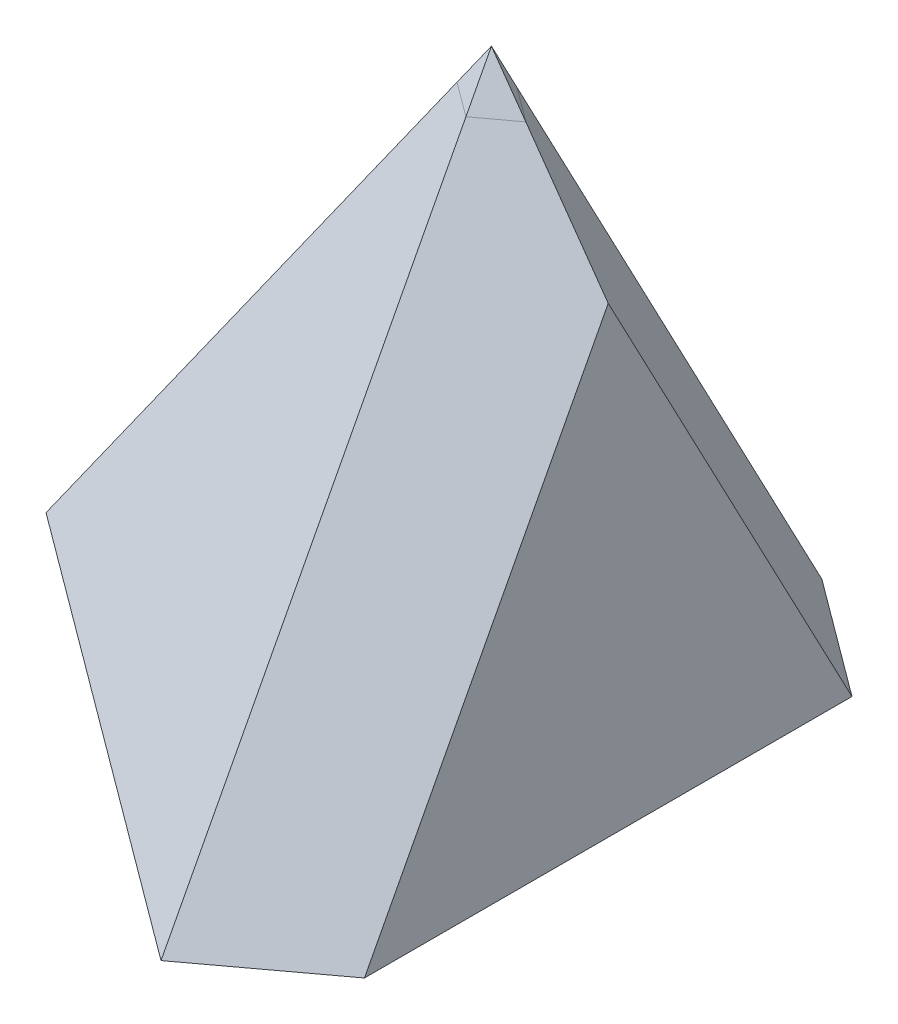
ISO-10303-21;
HEADER;
FILE_DESCRIPTION(('STEP AP214'),'2;1');
FILE_NAME('part.step','',(''),(''),'','','');
FILE_SCHEMA(('AUTOMOTIVE_DESIGN { 1 0 10303 214 1 1 1 1 }'));
ENDSEC;
DATA;
#1=APPLICATION_CONTEXT('core data for automotive mechanical design processes');
#2=APPLICATION_PROTOCOL_DEFINITION('international standard','automotive_design',2000,#1);
#3=PRODUCT_CONTEXT('',#1,'mechanical');
#4=PRODUCT('Part','Part','',(#3));
#5=PRODUCT_RELATED_PRODUCT_CATEGORY('part','',(#4));
#6=PRODUCT_DEFINITION_FORMATION('','',#4);
#7=PRODUCT_DEFINITION_CONTEXT('part definition',#1,'design');
#8=PRODUCT_DEFINITION('design','',#6,#7);
#9=PRODUCT_DEFINITION_SHAPE('','',#8);
#10=(LENGTH_UNIT() NAMED_UNIT(*) SI_UNIT(.MILLI.,.METRE.));
#11=(NAMED_UNIT(*) PLANE_ANGLE_UNIT() SI_UNIT($,.RADIAN.));
#12=(NAMED_UNIT(*) SI_UNIT($,.STERADIAN.) SOLID_ANGLE_UNIT());
#13=UNCERTAINTY_MEASURE_WITH_UNIT(LENGTH_MEASURE(1.E-05),#10,'distance_accuracy_value','');
#14=(GEOMETRIC_REPRESENTATION_CONTEXT(3) GLOBAL_UNCERTAINTY_ASSIGNED_CONTEXT((#13)) GLOBAL_UNIT_ASSIGNED_CONTEXT((#10,
#11,#12)) REPRESENTATION_CONTEXT('',''));
#15=CARTESIAN_POINT('',(0.,0.,0.));
#16=DIRECTION('',(0.,0.,1.));
#17=DIRECTION('',(1.,0.,0.));
#18=AXIS2_PLACEMENT_3D('',#15,#16,#17);
#19=CARTESIAN_POINT('',(-10.3859204869664,7.38088950846095,14.0189080119834));
#20=DIRECTION('',(-0.54824363547868,0.389616471863343,0.740018865306744));
#21=DIRECTION('',(0.803514858417285,0.,0.595284698528907));
#22=AXIS2_PLACEMENT_3D('',#19,#20,#21);
#23=PLANE('',#22);
#24=DIRECTION('',(0.803514858417285,0.,0.595284698528907));
#25=VECTOR('',#24,1.);
#26=CARTESIAN_POINT('',(-0.25183329590656,47.62214178044,0.33992440189573));
#27=LINE('',#26,#25);
#28=CARTESIAN_POINT('',(-0.710663009381156,47.62214178044,0.));
#29=VERTEX_POINT('',#28);
#30=CARTESIAN_POINT('',(0.,47.62214178044,0.526495323469693));
#31=VERTEX_POINT('',#30);
#32=EDGE_CURVE('E206',#29,#31,#27,.T.);
#33=ORIENTED_EDGE('',*,*,#32,.F.);
#34=DIRECTION('',(0.57928117234268,0.815127795728553,0.));
#35=VECTOR('',#34,1.);
#36=CARTESIAN_POINT('',(-59.5546481173834,-35.1793890875358,0.));
#37=LINE('',#36,#35);
#38=CARTESIAN_POINT('',(-59.5546481173834,-35.1793890875358,0.));
#39=VERTEX_POINT('',#38);
#40=EDGE_CURVE('E210',#39,#29,#37,.T.);
#41=ORIENTED_EDGE('',*,*,#40,.F.);
#42=DIRECTION('',(-0.803514858417285,0.,-0.595284698528906));
#43=VECTOR('',#42,1.);
#44=CARTESIAN_POINT('',(-59.5546481173834,-35.1793890875358,0.));
#45=LINE('',#44,#43);
#46=CARTESIAN_POINT('',(0.,-35.1793890875358,44.1211141015896));
#47=VERTEX_POINT('',#46);
#48=EDGE_CURVE('E209',#47,#39,#45,.T.);
#49=ORIENTED_EDGE('',*,*,#48,.F.);
#50=DIRECTION('',(0.,0.884852739411958,-0.465870829259735));
#51=VECTOR('',#50,1.);
#52=CARTESIAN_POINT('',(0.,-35.1793890875358,44.1211141015896));
#53=LINE('',#52,#51);
#54=EDGE_CURVE('E215',#47,#31,#53,.T.);
#55=ORIENTED_EDGE('',*,*,#54,.T.);
#56=EDGE_LOOP('',(#33,#41,#49,#55));
#57=FACE_BOUND('',#56,.T.);
#58=ADVANCED_FACE('F54',(#57),#23,.T.);
#59=CARTESIAN_POINT('',(-10.3859204869664,7.38088950846095,-14.0189080119834));
#60=DIRECTION('',(-0.54824363547868,0.389616471863343,-0.740018865306744));
#61=DIRECTION('',(-0.803514858417285,0.,0.595284698528907));
#62=AXIS2_PLACEMENT_3D('',#59,#60,#61);
#63=PLANE('',#62);
#64=DIRECTION('',(-0.803514858417285,0.,0.595284698528907));
#65=VECTOR('',#64,1.);
#66=CARTESIAN_POINT('',(-0.251833295906561,47.62214178044,-0.33992440189573));
#67=LINE('',#66,#65);
#68=CARTESIAN_POINT('',(0.,47.62214178044,-0.526495323469683));
#69=VERTEX_POINT('',#68);
#70=EDGE_CURVE('E203',#69,#29,#67,.T.);
#71=ORIENTED_EDGE('',*,*,#70,.F.);
#72=DIRECTION('',(0.,0.884852739411958,0.465870829259735));
#73=VECTOR('',#72,1.);
#74=CARTESIAN_POINT('',(0.,-35.1793890875358,-44.1211141015896));
#75=LINE('',#74,#73);
#76=CARTESIAN_POINT('',(0.,-35.1793890875358,-44.1211141015896));
#77=VERTEX_POINT('',#76);
#78=EDGE_CURVE('E218',#77,#69,#75,.T.);
#79=ORIENTED_EDGE('',*,*,#78,.F.);
#80=DIRECTION('',(0.803514858417285,0.,-0.595284698528906));
#81=VECTOR('',#80,1.);
#82=CARTESIAN_POINT('',(0.,-35.1793890875358,-44.1211141015896));
#83=LINE('',#82,#81);
#84=EDGE_CURVE('E227',#39,#77,#83,.T.);
#85=ORIENTED_EDGE('',*,*,#84,.F.);
#86=ORIENTED_EDGE('',*,*,#40,.T.);
#87=EDGE_LOOP('',(#71,#79,#85,#86));
#88=FACE_BOUND('',#87,.T.);
#89=ADVANCED_FACE('F367',(#88),#63,.T.);
#90=CARTESIAN_POINT('',(10.3859204869664,7.38088950846095,14.0189080119834));
#91=DIRECTION('',(0.54824363547868,0.389616471863343,0.740018865306744));
#92=DIRECTION('',(0.803514858417285,0.,-0.595284698528907));
#93=AXIS2_PLACEMENT_3D('',#90,#91,#92);
#94=PLANE('',#93);
#95=DIRECTION('',(0.803514858417285,0.,-0.595284698528907));
#96=VECTOR('',#95,1.);
#97=CARTESIAN_POINT('',(0.25183329590656,47.62214178044,0.33992440189573));
#98=LINE('',#97,#96);
#99=CARTESIAN_POINT('',(0.710663009381138,47.62214178044,0.));
#100=VERTEX_POINT('',#99);
#101=EDGE_CURVE('E80',#31,#100,#98,.T.);
#102=ORIENTED_EDGE('',*,*,#101,.F.);
#103=ORIENTED_EDGE('',*,*,#54,.F.);
#104=DIRECTION('',(-0.803514858417285,0.,0.595284698528907));
#105=VECTOR('',#104,1.);
#106=CARTESIAN_POINT('',(0.,-35.1793890875358,44.1211141015896));
#107=LINE('',#106,#105);
#108=CARTESIAN_POINT('',(59.5546481173834,-35.1793890875358,0.));
#109=VERTEX_POINT('',#108);
#110=EDGE_CURVE('E237',#109,#47,#107,.T.);
#111=ORIENTED_EDGE('',*,*,#110,.F.);
#112=DIRECTION('',(-0.57928117234268,0.815127795728553,0.));
#113=VECTOR('',#112,1.);
#114=CARTESIAN_POINT('',(59.5546481173834,-35.1793890875358,0.));
#115=LINE('',#114,#113);
#116=EDGE_CURVE('E214',#109,#100,#115,.T.);
#117=ORIENTED_EDGE('',*,*,#116,.T.);
#118=EDGE_LOOP('',(#102,#103,#111,#117));
#119=FACE_BOUND('',#118,.T.);
#120=ADVANCED_FACE('F373',(#119),#94,.T.);
#121=CARTESIAN_POINT('',(10.3859204869664,7.38088950846095,-14.0189080119834));
#122=DIRECTION('',(0.54824363547868,0.389616471863343,-0.740018865306744));
#123=DIRECTION('',(-0.803514858417285,0.,-0.595284698528906));
#124=AXIS2_PLACEMENT_3D('',#121,#122,#123);
#125=PLANE('',#124);
#126=DIRECTION('',(-0.803514858417285,0.,-0.595284698528906));
#127=VECTOR('',#126,1.);
#128=CARTESIAN_POINT('',(0.251833295906561,47.62214178044,-0.339924401895727));
#129=LINE('',#128,#127);
#130=EDGE_CURVE('E65',#100,#69,#129,.T.);
#131=ORIENTED_EDGE('',*,*,#130,.F.);
#132=ORIENTED_EDGE('',*,*,#116,.F.);
#133=DIRECTION('',(0.803514858417285,0.,0.595284698528906));
#134=VECTOR('',#133,1.);
#135=CARTESIAN_POINT('',(59.5546481173834,-35.1793890875358,0.));
#136=LINE('',#135,#134);
#137=EDGE_CURVE('E241',#77,#109,#136,.T.);
#138=ORIENTED_EDGE('',*,*,#137,.F.);
#139=ORIENTED_EDGE('',*,*,#78,.T.);
#140=EDGE_LOOP('',(#131,#132,#138,#139));
#141=FACE_BOUND('',#140,.T.);
#142=ADVANCED_FACE('F56',(#141),#125,.T.);
#143=CARTESIAN_POINT('',(0.,47.62214178044,0.));
#144=DIRECTION('',(0.,-1.,0.));
#145=DIRECTION('',(0.,0.,-1.));
#146=AXIS2_PLACEMENT_3D('',#143,#144,#145);
#147=PLANE('',#146);
#148=CARTESIAN_POINT('',(0.,47.62214178044,0.));
#149=DIRECTION('',(0.,-1.,0.));
#150=DIRECTION('',(0.,0.,-1.));
#151=AXIS2_PLACEMENT_3D('',#148,#149,#150);
#152=CIRCLE('',#151,0.268132751535743);
#153=CARTESIAN_POINT('',(0.,47.62214178044,-0.268132751535743));
#154=VERTEX_POINT('',#153);
#155=EDGE_CURVE('E197',#154,#154,#152,.T.);
#156=ORIENTED_EDGE('',*,*,#155,.T.);
#157=EDGE_LOOP('',(#156));
#158=FACE_BOUND('',#157,.T.);
#159=ORIENTED_EDGE('',*,*,#32,.T.);
#160=ORIENTED_EDGE('',*,*,#101,.T.);
#161=ORIENTED_EDGE('',*,*,#130,.T.);
#162=ORIENTED_EDGE('',*,*,#70,.T.);
#163=EDGE_LOOP('',(#159,#160,#161,#162));
#164=FACE_BOUND('',#163,.T.);
#165=ADVANCED_FACE('F378',(#158,#164),#147,.F.);
#166=CARTESIAN_POINT('',(0.,48.62214178044,0.));
#167=DIRECTION('',(0.,-1.,0.));
#168=DIRECTION('',(0.,0.,-1.));
#169=AXIS2_PLACEMENT_3D('',#166,#167,#168);
#170=CYLINDRICAL_SURFACE('',#169,0.268132751535743);
#171=CARTESIAN_POINT('',(0.,48.62214178044,0.));
#172=DIRECTION('',(0.,-1.,0.));
#173=DIRECTION('',(0.,0.,-1.));
#174=AXIS2_PLACEMENT_3D('',#171,#172,#173);
#175=CIRCLE('',#174,0.268132751535743);
#176=CARTESIAN_POINT('',(0.,48.62214178044,-0.268132751535743));
#177=VERTEX_POINT('',#176);
#178=EDGE_CURVE('E188',#177,#177,#175,.T.);
#179=ORIENTED_EDGE('',*,*,#178,.T.);
#180=EDGE_LOOP('',(#179));
#181=FACE_BOUND('',#180,.T.);
#182=ORIENTED_EDGE('',*,*,#155,.F.);
#183=EDGE_LOOP('',(#182));
#184=FACE_BOUND('',#183,.T.);
#185=ADVANCED_FACE('F392',(#181,#184),#170,.T.);
#186=CARTESIAN_POINT('',(0.,48.62214178044,0.));
#187=DIRECTION('',(0.,-1.,0.));
#188=DIRECTION('',(0.,0.,-1.));
#189=AXIS2_PLACEMENT_3D('',#186,#187,#188);
#190=PLANE('',#189);
#191=ORIENTED_EDGE('',*,*,#178,.F.);
#192=EDGE_LOOP('',(#191));
#193=FACE_BOUND('',#192,.T.);
#194=ADVANCED_FACE('F159',(#193),#190,.F.);
#195=CARTESIAN_POINT('',(0.,-1036.37785821956,0.));
#196=DIRECTION('',(0.,1.,0.));
#197=DIRECTION('',(0.,0.,1.));
#198=AXIS2_PLACEMENT_3D('',#195,#196,#197);
#199=PLANE('',#198);
#200=DIRECTION('',(0.803143152942257,0.,0.595786099100986));
#201=VECTOR('',#200,1.);
#202=CARTESIAN_POINT('',(771.069365178562,-1036.37785821956,-5.88938620094126E-13));
#203=LINE('',#202,#201);
#204=CARTESIAN_POINT('',(0.,-1036.37785821956,-571.993183946173));
#205=VERTEX_POINT('',#204);
#206=CARTESIAN_POINT('',(202.2,-1036.37785821956,-421.99757133727));
#207=VERTEX_POINT('',#206);
#208=EDGE_CURVE('E58',#205,#207,#203,.T.);
#209=ORIENTED_EDGE('',*,*,#208,.T.);
#210=DIRECTION('',(0.,0.,-1.));
#211=VECTOR('',#210,1.);
#212=CARTESIAN_POINT('',(202.2,-1036.37785821956,0.));
#213=LINE('',#212,#211);
#214=CARTESIAN_POINT('',(202.2,-1036.37785821956,421.99757133727));
#215=VERTEX_POINT('',#214);
#216=EDGE_CURVE('E114',#215,#207,#213,.T.);
#217=ORIENTED_EDGE('',*,*,#216,.F.);
#218=DIRECTION('',(-0.803143152942257,0.,0.595786099100987));
#219=VECTOR('',#218,1.);
#220=CARTESIAN_POINT('',(0.,-1036.37785821956,571.993183946173));
#221=LINE('',#220,#219);
#222=CARTESIAN_POINT('',(0.,-1036.37785821956,571.993183946173));
#223=VERTEX_POINT('',#222);
#224=EDGE_CURVE('E138',#215,#223,#221,.T.);
#225=ORIENTED_EDGE('',*,*,#224,.T.);
#226=DIRECTION('',(-0.803143152942257,0.,-0.595786099100987));
#227=VECTOR('',#226,1.);
#228=CARTESIAN_POINT('',(-771.069365178562,-1036.37785821956,0.));
#229=LINE('',#228,#227);
#230=CARTESIAN_POINT('',(-771.069365178562,-1036.37785821956,0.));
#231=VERTEX_POINT('',#230);
#232=EDGE_CURVE('E177',#223,#231,#229,.T.);
#233=ORIENTED_EDGE('',*,*,#232,.T.);
#234=DIRECTION('',(0.803143152942257,0.,-0.595786099100987));
#235=VECTOR('',#234,1.);
#236=CARTESIAN_POINT('',(0.,-1036.37785821956,-571.993183946173));
#237=LINE('',#236,#235);
#238=EDGE_CURVE('E131',#231,#205,#237,.T.);
#239=ORIENTED_EDGE('',*,*,#238,.T.);
#240=EDGE_LOOP('',(#209,#217,#225,#233,#239));
#241=FACE_BOUND('',#240,.T.);
#242=ADVANCED_FACE('F133',(#241),#199,.F.);
#243=CARTESIAN_POINT('',(0.,-1036.37785821956,-571.993183946173));
#244=CARTESIAN_POINT('',(0.,-35.1793890875358,-44.1211141015896));
#245=CARTESIAN_POINT('',(-128.511560863094,-1036.37785821956,-476.660986621811));
#246=CARTESIAN_POINT('',(-9.92577468623054,-35.1793890875358,-36.767595084658));
#247=CARTESIAN_POINT('',(-257.023121726187,-1036.37785821956,-381.328789297449));
#248=CARTESIAN_POINT('',(-19.8515493724611,-35.1793890875358,-29.4140760677264));
#249=CARTESIAN_POINT('',(-514.046243452374,-1036.37785821956,-190.664394648724));
#250=CARTESIAN_POINT('',(-39.7030987449222,-35.1793890875358,-14.7070380338632));
#251=CARTESIAN_POINT('',(-642.557804315468,-1036.37785821956,-95.3321973243621));
#252=CARTESIAN_POINT('',(-49.6288734311528,-35.1793890875358,-7.35351901693161));
#253=CARTESIAN_POINT('',(-771.069365178562,-1036.37785821956,1.11022302462516E-13));
#254=CARTESIAN_POINT('',(-59.5546481173834,-35.1793890875358,0.));
#255=B_SPLINE_SURFACE_WITH_KNOTS('',3,1,((#243,#244),(#245,#246),(#247,#248),(#249,#250),(#251,
#252),(#253,#254)),.UNSPECIFIED.,.F.,.F.,.F.,(4,2,4),(2,2),(0.,0.5,1.),(0.,1.),.UNSPECIFIED.);
#256=DIRECTION('',(0.579281172342686,0.815127795728549,0.));
#257=VECTOR('',#256,1.);
#258=CARTESIAN_POINT('',(-415.312006647973,-535.778623653548,0.));
#259=LINE('',#258,#257);
#260=EDGE_CURVE('E322',#231,#39,#259,.T.);
#261=DIRECTION('',(0.,-0.884580975215084,-0.466386640339891));
#262=VECTOR('',#261,1.);
#263=CARTESIAN_POINT('',(0.,-535.778623653548,-308.057149023881));
#264=LINE('',#263,#262);
#265=EDGE_CURVE('E137',#77,#205,#264,.T.);
#266=ORIENTED_EDGE('',*,*,#238,.F.);
#267=ORIENTED_EDGE('',*,*,#260,.T.);
#268=ORIENTED_EDGE('',*,*,#84,.T.);
#269=ORIENTED_EDGE('',*,*,#265,.T.);
#270=EDGE_LOOP('',(#266,#267,#268,#269));
#271=FACE_BOUND('',#270,.T.);
#272=ADVANCED_FACE('F158',(#271),#255,.T.);
#273=CARTESIAN_POINT('',(-771.069365178562,-1036.37785821956,0.));
#274=CARTESIAN_POINT('',(-59.5546481173834,-35.1793890875358,0.));
#275=CARTESIAN_POINT('',(-642.557804315468,-1036.37785821956,95.3321973243623));
#276=CARTESIAN_POINT('',(-49.6288734311528,-35.1793890875358,7.3535190169316));
#277=CARTESIAN_POINT('',(-514.046243452374,-1036.37785821956,190.664394648725));
#278=CARTESIAN_POINT('',(-39.7030987449223,-35.1793890875358,14.7070380338632));
#279=CARTESIAN_POINT('',(-257.023121726187,-1036.37785821956,381.328789297449));
#280=CARTESIAN_POINT('',(-19.8515493724611,-35.1793890875358,29.4140760677264));
#281=CARTESIAN_POINT('',(-128.511560863093,-1036.37785821956,476.660986621811));
#282=CARTESIAN_POINT('',(-9.92577468623057,-35.1793890875358,36.767595084658));
#283=CARTESIAN_POINT('',(2.22044604925031E-13,-1036.37785821956,571.993183946173));
#284=CARTESIAN_POINT('',(0.,-35.1793890875358,44.1211141015896));
#285=B_SPLINE_SURFACE_WITH_KNOTS('',3,1,((#273,#274),(#275,#276),(#277,#278),(#279,#280),(#281,
#282),(#283,#284)),.UNSPECIFIED.,.F.,.F.,.F.,(4,2,4),(2,2),(0.,0.5,1.),(0.,1.),.UNSPECIFIED.);
#286=DIRECTION('',(0.,0.884580975215084,-0.466386640339891));
#287=VECTOR('',#286,1.);
#288=CARTESIAN_POINT('',(1.11022302462516E-13,-535.778623653548,308.057149023881));
#289=LINE('',#288,#287);
#290=EDGE_CURVE('E339',#223,#47,#289,.T.);
#291=ORIENTED_EDGE('',*,*,#232,.F.);
#292=ORIENTED_EDGE('',*,*,#290,.T.);
#293=ORIENTED_EDGE('',*,*,#48,.T.);
#294=ORIENTED_EDGE('',*,*,#260,.F.);
#295=EDGE_LOOP('',(#291,#292,#293,#294));
#296=FACE_BOUND('',#295,.T.);
#297=ADVANCED_FACE('F347',(#296),#285,.T.);
#298=CARTESIAN_POINT('',(771.069365178562,-1036.37785821956,-5.88938620094126E-13));
#299=CARTESIAN_POINT('',(59.5546481173834,-35.1793890875358,0.));
#300=CARTESIAN_POINT('',(642.557804315468,-1036.37785821956,-95.3321973243625));
#301=CARTESIAN_POINT('',(49.6288734311528,-35.1793890875358,-7.3535190169316));
#302=CARTESIAN_POINT('',(514.046243452375,-1036.37785821956,-190.664394648725));
#303=CARTESIAN_POINT('',(39.7030987449223,-35.1793890875358,-14.7070380338632));
#304=CARTESIAN_POINT('',(257.023121726187,-1036.37785821956,-381.328789297449));
#305=CARTESIAN_POINT('',(19.8515493724612,-35.1793890875358,-29.4140760677264));
#306=CARTESIAN_POINT('',(128.511560863094,-1036.37785821956,-476.660986621811));
#307=CARTESIAN_POINT('',(9.92577468623059,-35.1793890875358,-36.767595084658));
#308=CARTESIAN_POINT('',(2.22044604925031E-13,-1036.37785821956,-571.993183946173));
#309=CARTESIAN_POINT('',(0.,-35.1793890875358,-44.1211141015896));
#310=B_SPLINE_SURFACE_WITH_KNOTS('',3,1,((#298,#299),(#300,#301),(#302,#303),(#304,#305),(#306,
#307),(#308,#309)),.UNSPECIFIED.,.F.,.F.,.F.,(4,2,4),(2,2),(0.,0.5,1.),(0.,1.),.UNSPECIFIED.);
#311=CARTESIAN_POINT('',(202.2,-1036.37785821956,-421.99757133727));
#312=CARTESIAN_POINT('',(202.2,-1003.02523569574,-404.413231307797));
#313=CARTESIAN_POINT('',(202.2,-969.672594339979,-386.828926997764));
#314=CARTESIAN_POINT('',(202.2,-902.967259913828,-351.660416465078));
#315=CARTESIAN_POINT('',(202.2,-869.614566843441,-334.076210242423));
#316=CARTESIAN_POINT('',(202.2,-769.556388901436,-281.323778634598));
#317=CARTESIAN_POINT('',(202.2,-702.850805383744,-246.155740354262));
#318=CARTESIAN_POINT('',(202.2,-602.791993349195,-193.404511330088));
#319=CARTESIAN_POINT('',(202.2,-569.438983201607,-175.820906382953));
#320=CARTESIAN_POINT('',(202.2,-502.732725685662,-140.654146499269));
#321=CARTESIAN_POINT('',(202.2,-469.379478317304,-123.07099156272));
#322=CARTESIAN_POINT('',(202.2,-419.349294061192,-96.6968531772));
#323=CARTESIAN_POINT('',(202.2,-402.672513753109,-87.9055727069191));
#324=CARTESIAN_POINT('',(202.2,-369.318804694521,-70.3232933689937));
#325=CARTESIAN_POINT('',(202.2,-352.641875944015,-61.5322945013491));
#326=CARTESIAN_POINT('',(202.2,-319.287811093244,-43.9506900851342));
#327=CARTESIAN_POINT('',(202.2,-302.61067499298,-35.1600845365643));
#328=CARTESIAN_POINT('',(202.2,-269.25606883486,-17.5795070185157));
#329=CARTESIAN_POINT('',(202.2,-252.578598777005,-8.78953504903733));
#330=CARTESIAN_POINT('',(202.2,-235.900898438121,-1.21484326531374E-13));
#331=B_SPLINE_CURVE_WITH_KNOTS('',3,(#311,#312,#313,#314,#315,#316,#317,#318,#319,#320,#321,
#322,#323,#324,#325,#326,#327,#328,#329,#330),.UNSPECIFIED.,.F.,.F.,(4,2,2,2,2,2,2,2,2,4),(0.,
113.112589888502,226.225179779205,452.450359848111,565.562949948603,678.675539991555,
735.231835163034,791.788130325336,848.344425540259,904.900720787201),.UNSPECIFIED.);
#332=CARTESIAN_POINT('',(202.2,-235.900898438121,-1.77996324538183E-13));
#333=VERTEX_POINT('',#332);
#334=EDGE_CURVE('E72',#207,#333,#331,.T.);
#335=DIRECTION('',(-0.579281172342686,0.815127795728549,0.));
#336=VECTOR('',#335,1.);
#337=CARTESIAN_POINT('',(415.312006647973,-535.778623653548,-4.02455846426619E-13));
#338=LINE('',#337,#336);
#339=EDGE_CURVE('E129',#333,#109,#338,.T.);
#340=ORIENTED_EDGE('',*,*,#334,.F.);
#341=ORIENTED_EDGE('',*,*,#208,.F.);
#342=ORIENTED_EDGE('',*,*,#265,.F.);
#343=ORIENTED_EDGE('',*,*,#137,.T.);
#344=ORIENTED_EDGE('',*,*,#339,.F.);
#345=EDGE_LOOP('',(#340,#341,#342,#343,#344));
#346=FACE_BOUND('',#345,.T.);
#347=ADVANCED_FACE('F124',(#346),#310,.T.);
#348=CARTESIAN_POINT('',(0.,-1036.37785821956,571.993183946173));
#349=CARTESIAN_POINT('',(0.,-35.1793890875358,44.1211141015896));
#350=CARTESIAN_POINT('',(128.511560863095,-1036.37785821956,476.66098662181));
#351=CARTESIAN_POINT('',(9.92577468623055,-35.1793890875358,36.767595084658));
#352=CARTESIAN_POINT('',(257.023121726189,-1036.37785821956,381.328789297447));
#353=CARTESIAN_POINT('',(19.8515493724611,-35.1793890875358,29.4140760677264));
#354=CARTESIAN_POINT('',(514.046243452376,-1036.37785821956,190.664394648723));
#355=CARTESIAN_POINT('',(39.7030987449222,-35.1793890875358,14.7070380338632));
#356=CARTESIAN_POINT('',(642.557804315469,-1036.37785821956,95.3321973243607));
#357=CARTESIAN_POINT('',(49.6288734311528,-35.1793890875358,7.35351901693159));
#358=CARTESIAN_POINT('',(771.069365178562,-1036.37785821956,-7.7715611723761E-13));
#359=CARTESIAN_POINT('',(59.5546481173834,-35.1793890875358,0.));
#360=B_SPLINE_SURFACE_WITH_KNOTS('',3,1,((#348,#349),(#350,#351),(#352,#353),(#354,#355),(#356,
#357),(#358,#359)),.UNSPECIFIED.,.F.,.F.,.F.,(4,2,4),(2,2),(0.,0.5,1.),(0.,1.),.UNSPECIFIED.);
#361=CARTESIAN_POINT('',(202.2,-235.900898438121,-1.77996324538183E-13));
#362=CARTESIAN_POINT('',(202.2,-253.595290993985,9.32536156004895));
#363=CARTESIAN_POINT('',(202.2,-271.28942766083,18.6512086251436));
#364=CARTESIAN_POINT('',(202.2,-306.677334290439,37.3035984558417));
#365=CARTESIAN_POINT('',(202.2,-324.371104253204,46.6301412214447));
#366=CARTESIAN_POINT('',(202.2,-359.758422553918,65.2836471463744));
#367=CARTESIAN_POINT('',(202.2,-377.451970891868,74.6106103057008));
#368=CARTESIAN_POINT('',(202.2,-412.838910043785,93.2648354541032));
#369=CARTESIAN_POINT('',(202.2,-430.532300857753,102.592097443179));
#370=CARTESIAN_POINT('',(202.2,-497.239114417654,137.757802519472));
#371=CARTESIAN_POINT('',(202.2,-546.252180711988,163.596921766264));
#372=CARTESIAN_POINT('',(202.2,-644.277943828368,215.275861142141));
#373=CARTESIAN_POINT('',(202.2,-693.290640650412,241.115681271225));
#374=CARTESIAN_POINT('',(202.2,-791.315827881255,292.7957131312));
#375=CARTESIAN_POINT('',(202.2,-840.328318290053,318.63592486209));
#376=CARTESIAN_POINT('',(202.2,-938.353167864541,370.316597154076));
#377=CARTESIAN_POINT('',(202.2,-987.365527030231,396.157057715172));
#378=CARTESIAN_POINT('',(202.2,-1036.37785821956,421.99757133727));
#379=B_SPLINE_CURVE_WITH_KNOTS('',3,(#361,#362,#363,#364,#365,#366,#367,#368,#369,#370,#371,
#372,#373,#374,#375,#376,#377,#378),.UNSPECIFIED.,.F.,.F.,(4,2,2,2,2,2,2,2,4),(0.,
60.0040420468021,120.008084056537,180.012126010143,240.016167974879,406.23730608191,
572.458444287471,738.679582609073,904.900720784787),.UNSPECIFIED.);
#380=EDGE_CURVE('E12',#333,#215,#379,.T.);
#381=ORIENTED_EDGE('',*,*,#380,.F.);
#382=ORIENTED_EDGE('',*,*,#339,.T.);
#383=ORIENTED_EDGE('',*,*,#110,.T.);
#384=ORIENTED_EDGE('',*,*,#290,.F.);
#385=ORIENTED_EDGE('',*,*,#224,.F.);
#386=EDGE_LOOP('',(#381,#382,#383,#384,#385));
#387=FACE_BOUND('',#386,.T.);
#388=ADVANCED_FACE('F272',(#387),#360,.T.);
#389=CARTESIAN_POINT('',(202.2,48.62214178044,0.));
#390=DIRECTION('',(-1.,0.,0.));
#391=DIRECTION('',(0.,0.,1.));
#392=AXIS2_PLACEMENT_3D('',#389,#390,#391);
#393=PLANE('',#392);
#394=ORIENTED_EDGE('',*,*,#334,.T.);
#395=ORIENTED_EDGE('',*,*,#380,.T.);
#396=ORIENTED_EDGE('',*,*,#216,.T.);
#397=EDGE_LOOP('',(#394,#395,#396));
#398=FACE_BOUND('',#397,.T.);
#399=ADVANCED_FACE('F115',(#398),#393,.F.);
#400=CLOSED_SHELL('',(#58,#89,#120,#142,#165,#185,#194,#242,#272,#297,#347,#388,#399));
#401=MANIFOLD_SOLID_BREP('B2',#400);
#402=ADVANCED_BREP_SHAPE_REPRESENTATION('',(#18,#401),#14);
#403=SHAPE_DEFINITION_REPRESENTATION(#9,#402);
ENDSEC;
END-ISO-10303-21;
